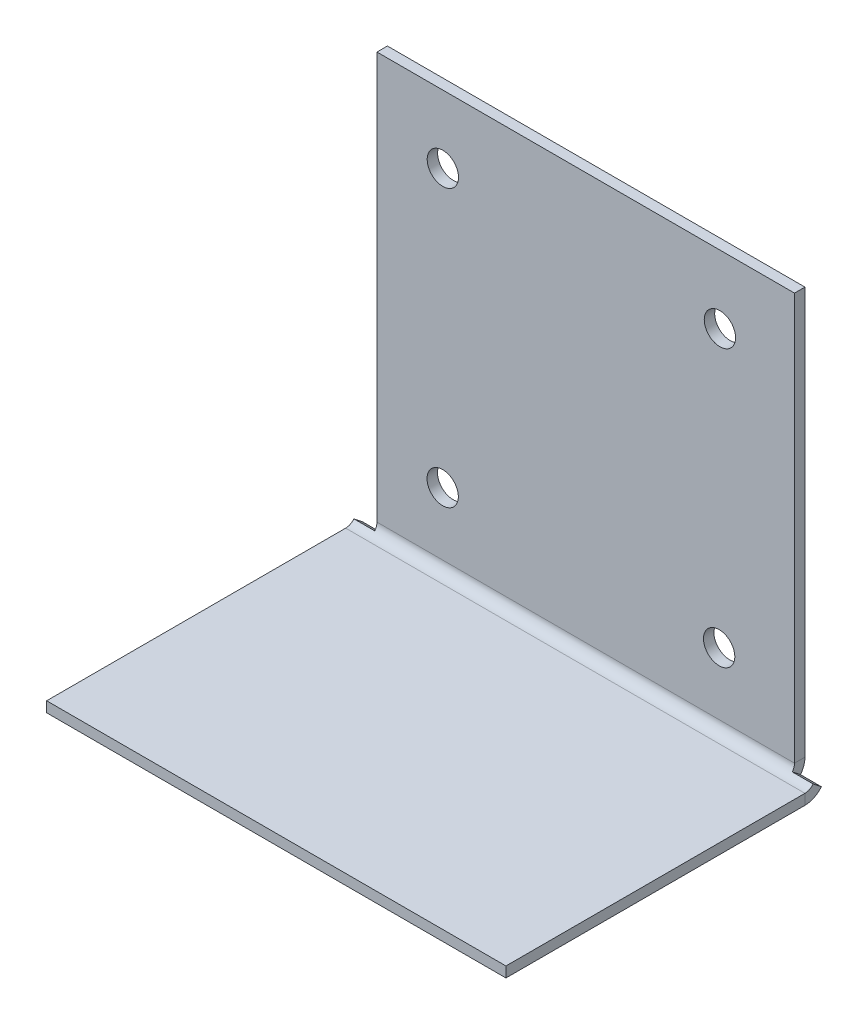
ISO-10303-21;
HEADER;
FILE_DESCRIPTION(('STEP AP214'),'2;1');
FILE_NAME('part.step','',(''),(''),'','','');
FILE_SCHEMA(('AUTOMOTIVE_DESIGN { 1 0 10303 214 1 1 1 1 }'));
ENDSEC;
DATA;
#1=APPLICATION_CONTEXT('core data for automotive mechanical design processes');
#2=APPLICATION_PROTOCOL_DEFINITION('international standard','automotive_design',2000,#1);
#3=PRODUCT_CONTEXT('',#1,'mechanical');
#4=PRODUCT('Part','Part','',(#3));
#5=PRODUCT_RELATED_PRODUCT_CATEGORY('part','',(#4));
#6=PRODUCT_DEFINITION_FORMATION('','',#4);
#7=PRODUCT_DEFINITION_CONTEXT('part definition',#1,'design');
#8=PRODUCT_DEFINITION('design','',#6,#7);
#9=PRODUCT_DEFINITION_SHAPE('','',#8);
#10=(LENGTH_UNIT() NAMED_UNIT(*) SI_UNIT(.MILLI.,.METRE.));
#11=(NAMED_UNIT(*) PLANE_ANGLE_UNIT() SI_UNIT($,.RADIAN.));
#12=(NAMED_UNIT(*) SI_UNIT($,.STERADIAN.) SOLID_ANGLE_UNIT());
#13=UNCERTAINTY_MEASURE_WITH_UNIT(LENGTH_MEASURE(1.E-05),#10,'distance_accuracy_value','');
#14=(GEOMETRIC_REPRESENTATION_CONTEXT(3) GLOBAL_UNCERTAINTY_ASSIGNED_CONTEXT((#13)) GLOBAL_UNIT_ASSIGNED_CONTEXT((#10,
#11,#12)) REPRESENTATION_CONTEXT('',''));
#15=CARTESIAN_POINT('',(0.,0.,0.));
#16=DIRECTION('',(0.,0.,1.));
#17=DIRECTION('',(1.,0.,0.));
#18=AXIS2_PLACEMENT_3D('',#15,#16,#17);
#19=CARTESIAN_POINT('',(-16.7534524957354,-16.2307969960273,1.24380550980765));
#20=DIRECTION('',(-1.,0.,0.));
#21=DIRECTION('',(0.,0.,-1.));
#22=AXIS2_PLACEMENT_3D('',#19,#20,#21);
#23=PLANE('',#22);
#24=DIRECTION('',(0.,0.,-1.));
#25=VECTOR('',#24,1.);
#26=CARTESIAN_POINT('',(-16.7534524957354,-17.2307969960274,-14.9869914862196));
#27=LINE('',#26,#25);
#28=CARTESIAN_POINT('',(-16.7534524957354,-17.2307969960272,31.2438055098077));
#29=VERTEX_POINT('',#28);
#30=CARTESIAN_POINT('',(-16.7534524957354,-17.2307969960273,2.6));
#31=VERTEX_POINT('',#30);
#32=EDGE_CURVE('E73',#29,#31,#27,.T.);
#33=ORIENTED_EDGE('',*,*,#32,.T.);
#34=DIRECTION('',(0.,1.,0.));
#35=VECTOR('',#34,1.);
#36=CARTESIAN_POINT('',(-16.7534524957354,-16.2307969960273,2.6));
#37=LINE('',#36,#35);
#38=CARTESIAN_POINT('',(-16.7534524957354,-16.2307969960273,2.6));
#39=VERTEX_POINT('',#38);
#40=EDGE_CURVE('E265',#31,#39,#37,.T.);
#41=ORIENTED_EDGE('',*,*,#40,.T.);
#42=DIRECTION('',(0.,0.,-1.));
#43=VECTOR('',#42,1.);
#44=CARTESIAN_POINT('',(-16.7534524957354,-16.2307969960273,1.24380550980765));
#45=LINE('',#44,#43);
#46=CARTESIAN_POINT('',(-16.7534524957354,-16.2307969960272,31.2438055098076));
#47=VERTEX_POINT('',#46);
#48=EDGE_CURVE('E250',#47,#39,#45,.T.);
#49=ORIENTED_EDGE('',*,*,#48,.F.);
#50=DIRECTION('',(0.,1.,0.));
#51=VECTOR('',#50,1.);
#52=CARTESIAN_POINT('',(-16.7534524957354,-16.2307969960272,31.2438055098076));
#53=LINE('',#52,#51);
#54=EDGE_CURVE('E255',#29,#47,#53,.T.);
#55=ORIENTED_EDGE('',*,*,#54,.F.);
#56=EDGE_LOOP('',(#33,#41,#49,#55));
#57=FACE_BOUND('',#56,.T.);
#58=ADVANCED_FACE('F48',(#57),#23,.F.);
#59=CARTESIAN_POINT('',(-60.7534524957354,-16.2307969960272,31.2438055098077));
#60=DIRECTION('',(1.,0.,0.));
#61=DIRECTION('',(0.,0.,1.));
#62=AXIS2_PLACEMENT_3D('',#59,#60,#61);
#63=PLANE('',#62);
#64=DIRECTION('',(0.,0.,1.));
#65=VECTOR('',#64,1.);
#66=CARTESIAN_POINT('',(-60.7534524957354,-16.2307969960272,31.2438055098077));
#67=LINE('',#66,#65);
#68=CARTESIAN_POINT('',(-60.7534524957354,-16.2307969960273,2.6));
#69=VERTEX_POINT('',#68);
#70=CARTESIAN_POINT('',(-60.7534524957354,-16.2307969960272,31.2438055098077));
#71=VERTEX_POINT('',#70);
#72=EDGE_CURVE('E52',#69,#71,#67,.T.);
#73=ORIENTED_EDGE('',*,*,#72,.F.);
#74=DIRECTION('',(0.,-1.,0.));
#75=VECTOR('',#74,1.);
#76=CARTESIAN_POINT('',(-60.7534524957354,-16.2307969960271,2.6));
#77=LINE('',#76,#75);
#78=CARTESIAN_POINT('',(-60.7534524957354,-17.2307969960273,2.6));
#79=VERTEX_POINT('',#78);
#80=EDGE_CURVE('E12',#69,#79,#77,.T.);
#81=ORIENTED_EDGE('',*,*,#80,.T.);
#82=DIRECTION('',(0.,0.,-1.));
#83=VECTOR('',#82,1.);
#84=CARTESIAN_POINT('',(-60.7534524957354,-17.2307969960274,-14.9869914862196));
#85=LINE('',#84,#83);
#86=CARTESIAN_POINT('',(-60.7534524957354,-17.2307969960272,31.2438055098077));
#87=VERTEX_POINT('',#86);
#88=EDGE_CURVE('E66',#79,#87,#85,.F.);
#89=ORIENTED_EDGE('',*,*,#88,.T.);
#90=DIRECTION('',(0.,1.,0.));
#91=VECTOR('',#90,1.);
#92=CARTESIAN_POINT('',(-60.7534524957354,-16.2307969960272,31.2438055098077));
#93=LINE('',#92,#91);
#94=EDGE_CURVE('E258',#87,#71,#93,.T.);
#95=ORIENTED_EDGE('',*,*,#94,.T.);
#96=EDGE_LOOP('',(#73,#81,#89,#95));
#97=FACE_BOUND('',#96,.T.);
#98=ADVANCED_FACE('F50',(#97),#63,.F.);
#99=CARTESIAN_POINT('',(0.,-17.2307969960274,-14.9869914862196));
#100=DIRECTION('',(0.,-1.,0.));
#101=DIRECTION('',(-1.,0.,0.));
#102=AXIS2_PLACEMENT_3D('',#99,#100,#101);
#103=PLANE('',#102);
#104=ORIENTED_EDGE('',*,*,#88,.F.);
#105=DIRECTION('',(1.,0.,0.));
#106=VECTOR('',#105,1.);
#107=CARTESIAN_POINT('',(0.,-17.2307969960273,2.6));
#108=LINE('',#107,#106);
#109=EDGE_CURVE('E58',#79,#31,#108,.T.);
#110=ORIENTED_EDGE('',*,*,#109,.T.);
#111=ORIENTED_EDGE('',*,*,#32,.F.);
#112=DIRECTION('',(-1.,0.,0.));
#113=VECTOR('',#112,1.);
#114=CARTESIAN_POINT('',(0.,-17.2307969960272,31.2438055098077));
#115=LINE('',#114,#113);
#116=EDGE_CURVE('E251',#87,#29,#115,.F.);
#117=ORIENTED_EDGE('',*,*,#116,.F.);
#118=EDGE_LOOP('',(#104,#110,#111,#117));
#119=FACE_BOUND('',#118,.T.);
#120=ADVANCED_FACE('F342',(#119),#103,.T.);
#121=CARTESIAN_POINT('',(-16.7534524957354,-16.2307969960272,31.2438055098076));
#122=DIRECTION('',(0.,0.,-1.));
#123=DIRECTION('',(1.,0.,0.));
#124=AXIS2_PLACEMENT_3D('',#121,#122,#123);
#125=PLANE('',#124);
#126=ORIENTED_EDGE('',*,*,#94,.F.);
#127=ORIENTED_EDGE('',*,*,#116,.T.);
#128=ORIENTED_EDGE('',*,*,#54,.T.);
#129=DIRECTION('',(1.,0.,0.));
#130=VECTOR('',#129,1.);
#131=CARTESIAN_POINT('',(-16.7534524957354,-16.2307969960272,31.2438055098076));
#132=LINE('',#131,#130);
#133=EDGE_CURVE('E246',#71,#47,#132,.T.);
#134=ORIENTED_EDGE('',*,*,#133,.F.);
#135=EDGE_LOOP('',(#126,#127,#128,#134));
#136=FACE_BOUND('',#135,.T.);
#137=ADVANCED_FACE('F347',(#136),#125,.F.);
#138=CARTESIAN_POINT('',(0.,-16.2307969960274,-14.9869914862196));
#139=DIRECTION('',(0.,-1.,0.));
#140=DIRECTION('',(-1.,0.,0.));
#141=AXIS2_PLACEMENT_3D('',#138,#139,#140);
#142=PLANE('',#141);
#143=DIRECTION('',(1.,0.,0.));
#144=VECTOR('',#143,1.);
#145=CARTESIAN_POINT('',(0.,-16.2307969960273,2.6));
#146=LINE('',#145,#144);
#147=EDGE_CURVE('E262',#69,#39,#146,.T.);
#148=ORIENTED_EDGE('',*,*,#147,.F.);
#149=ORIENTED_EDGE('',*,*,#72,.T.);
#150=ORIENTED_EDGE('',*,*,#133,.T.);
#151=ORIENTED_EDGE('',*,*,#48,.T.);
#152=EDGE_LOOP('',(#148,#149,#150,#151));
#153=FACE_BOUND('',#152,.T.);
#154=ADVANCED_FACE('F277',(#153),#142,.F.);
#155=CARTESIAN_POINT('',(-58.7534524957354,23.7692030039727,1.6));
#156=DIRECTION('',(0.,-1.,0.));
#157=DIRECTION('',(-1.,0.,0.));
#158=AXIS2_PLACEMENT_3D('',#155,#156,#157);
#159=PLANE('',#158);
#160=DIRECTION('',(0.,0.,1.));
#161=VECTOR('',#160,1.);
#162=CARTESIAN_POINT('',(-18.7534524957354,23.7692030039727,1.6));
#163=LINE('',#162,#161);
#164=CARTESIAN_POINT('',(-18.7534524957354,23.7692030039727,0.6));
#165=VERTEX_POINT('',#164);
#166=CARTESIAN_POINT('',(-18.7534524957354,23.7692030039727,1.6));
#167=VERTEX_POINT('',#166);
#168=EDGE_CURVE('E207',#165,#167,#163,.T.);
#169=ORIENTED_EDGE('',*,*,#168,.F.);
#170=DIRECTION('',(-1.,0.,0.));
#171=VECTOR('',#170,1.);
#172=CARTESIAN_POINT('',(0.,23.7692030039727,0.6));
#173=LINE('',#172,#171);
#174=CARTESIAN_POINT('',(-58.7534524957354,23.7692030039727,0.6));
#175=VERTEX_POINT('',#174);
#176=EDGE_CURVE('E231',#165,#175,#173,.T.);
#177=ORIENTED_EDGE('',*,*,#176,.T.);
#178=DIRECTION('',(0.,0.,1.));
#179=VECTOR('',#178,1.);
#180=CARTESIAN_POINT('',(-58.7534524957354,23.7692030039727,1.6));
#181=LINE('',#180,#179);
#182=CARTESIAN_POINT('',(-58.7534524957354,23.7692030039727,1.6));
#183=VERTEX_POINT('',#182);
#184=EDGE_CURVE('E228',#175,#183,#181,.T.);
#185=ORIENTED_EDGE('',*,*,#184,.T.);
#186=DIRECTION('',(-1.,0.,0.));
#187=VECTOR('',#186,1.);
#188=CARTESIAN_POINT('',(-58.7534524957354,23.7692030039727,1.6));
#189=LINE('',#188,#187);
#190=EDGE_CURVE('E214',#167,#183,#189,.T.);
#191=ORIENTED_EDGE('',*,*,#190,.F.);
#192=EDGE_LOOP('',(#169,#177,#185,#191));
#193=FACE_BOUND('',#192,.T.);
#194=ADVANCED_FACE('F321',(#193),#159,.F.);
#195=CARTESIAN_POINT('',(0.,0.,1.6));
#196=DIRECTION('',(0.,0.,-1.));
#197=DIRECTION('',(-1.,0.,0.));
#198=AXIS2_PLACEMENT_3D('',#195,#196,#197);
#199=PLANE('',#198);
#200=CARTESIAN_POINT('',(-25.9011337532143,17.2438518574703,1.6));
#201=DIRECTION('',(0.,0.,-1.));
#202=DIRECTION('',(-1.,0.,0.));
#203=AXIS2_PLACEMENT_3D('',#200,#201,#202);
#204=CIRCLE('',#203,1.49999999999999);
#205=CARTESIAN_POINT('',(-27.4011337532142,17.2438518574703,1.6));
#206=VERTEX_POINT('',#205);
#207=EDGE_CURVE('E396',#206,#206,#204,.T.);
#208=ORIENTED_EDGE('',*,*,#207,.T.);
#209=EDGE_LOOP('',(#208));
#210=FACE_BOUND('',#209,.T.);
#211=CARTESIAN_POINT('',(-52.4431202385651,17.2739049417213,1.6));
#212=DIRECTION('',(0.,0.,-1.));
#213=DIRECTION('',(-1.,0.,0.));
#214=AXIS2_PLACEMENT_3D('',#211,#212,#213);
#215=CIRCLE('',#214,1.49999999999999);
#216=CARTESIAN_POINT('',(-53.9431202385651,17.2739049417213,1.6));
#217=VERTEX_POINT('',#216);
#218=EDGE_CURVE('E390',#217,#217,#215,.T.);
#219=ORIENTED_EDGE('',*,*,#218,.T.);
#220=EDGE_LOOP('',(#219));
#221=FACE_BOUND('',#220,.T.);
#222=CARTESIAN_POINT('',(-25.9729526557759,-9.25790340729611,1.6));
#223=DIRECTION('',(0.,0.,-1.));
#224=DIRECTION('',(-1.,0.,0.));
#225=AXIS2_PLACEMENT_3D('',#222,#223,#224);
#226=CIRCLE('',#225,1.49999999999999);
#227=CARTESIAN_POINT('',(-27.4729526557758,-9.25790340729611,1.6));
#228=VERTEX_POINT('',#227);
#229=EDGE_CURVE('E380',#228,#228,#226,.T.);
#230=ORIENTED_EDGE('',*,*,#229,.T.);
#231=EDGE_LOOP('',(#230));
#232=FACE_BOUND('',#231,.T.);
#233=CARTESIAN_POINT('',(-52.4574838355913,-9.22245051781557,1.6));
#234=DIRECTION('',(0.,0.,-1.));
#235=DIRECTION('',(-1.,0.,0.));
#236=AXIS2_PLACEMENT_3D('',#233,#234,#235);
#237=CIRCLE('',#236,1.49999999999999);
#238=CARTESIAN_POINT('',(-53.9574838355913,-9.22245051781557,1.6));
#239=VERTEX_POINT('',#238);
#240=EDGE_CURVE('E197',#239,#239,#237,.T.);
#241=ORIENTED_EDGE('',*,*,#240,.T.);
#242=EDGE_LOOP('',(#241));
#243=FACE_BOUND('',#242,.T.);
#244=DIRECTION('',(0.,-1.,0.));
#245=VECTOR('',#244,1.);
#246=CARTESIAN_POINT('',(-58.7534524957354,-16.2307969960273,1.6));
#247=LINE('',#246,#245);
#248=CARTESIAN_POINT('',(-58.7534524957354,-15.2307969960273,1.6));
#249=VERTEX_POINT('',#248);
#250=EDGE_CURVE('E225',#183,#249,#247,.T.);
#251=ORIENTED_EDGE('',*,*,#250,.T.);
#252=DIRECTION('',(1.,0.,0.));
#253=VECTOR('',#252,1.);
#254=CARTESIAN_POINT('',(0.,-15.2307969960273,1.6));
#255=LINE('',#254,#253);
#256=CARTESIAN_POINT('',(-18.7534524957354,-15.2307969960273,1.6));
#257=VERTEX_POINT('',#256);
#258=EDGE_CURVE('E221',#249,#257,#255,.T.);
#259=ORIENTED_EDGE('',*,*,#258,.T.);
#260=DIRECTION('',(0.,1.,0.));
#261=VECTOR('',#260,1.);
#262=CARTESIAN_POINT('',(-18.7534524957354,23.7692030039727,1.6));
#263=LINE('',#262,#261);
#264=EDGE_CURVE('E218',#257,#167,#263,.T.);
#265=ORIENTED_EDGE('',*,*,#264,.T.);
#266=ORIENTED_EDGE('',*,*,#190,.T.);
#267=EDGE_LOOP('',(#251,#259,#265,#266));
#268=FACE_BOUND('',#267,.T.);
#269=ADVANCED_FACE('F323',(#210,#221,#232,#243,#268),#199,.F.);
#270=CARTESIAN_POINT('',(-18.7534524957354,23.7692030039727,1.6));
#271=DIRECTION('',(-1.,0.,0.));
#272=DIRECTION('',(0.,1.,0.));
#273=AXIS2_PLACEMENT_3D('',#270,#271,#272);
#274=PLANE('',#273);
#275=DIRECTION('',(0.,0.,1.));
#276=VECTOR('',#275,1.);
#277=CARTESIAN_POINT('',(-18.7534524957354,-15.2307969960273,1.59999999999973));
#278=LINE('',#277,#276);
#279=CARTESIAN_POINT('',(-18.7534524957354,-15.2307969960273,0.6));
#280=VERTEX_POINT('',#279);
#281=EDGE_CURVE('E235',#280,#257,#278,.T.);
#282=ORIENTED_EDGE('',*,*,#281,.F.);
#283=DIRECTION('',(0.,1.,0.));
#284=VECTOR('',#283,1.);
#285=CARTESIAN_POINT('',(-18.7534524957354,0.,0.6));
#286=LINE('',#285,#284);
#287=EDGE_CURVE('E211',#280,#165,#286,.T.);
#288=ORIENTED_EDGE('',*,*,#287,.T.);
#289=ORIENTED_EDGE('',*,*,#168,.T.);
#290=ORIENTED_EDGE('',*,*,#264,.F.);
#291=EDGE_LOOP('',(#282,#288,#289,#290));
#292=FACE_BOUND('',#291,.T.);
#293=ADVANCED_FACE('F302',(#292),#274,.F.);
#294=CARTESIAN_POINT('',(0.,0.,0.6));
#295=DIRECTION('',(0.,0.,-1.));
#296=DIRECTION('',(-1.,0.,0.));
#297=AXIS2_PLACEMENT_3D('',#294,#295,#296);
#298=PLANE('',#297);
#299=CARTESIAN_POINT('',(-25.9011337532143,17.2438518574703,0.599999999999998));
#300=DIRECTION('',(0.,0.,-1.));
#301=DIRECTION('',(-1.,0.,0.));
#302=AXIS2_PLACEMENT_3D('',#299,#300,#301);
#303=CIRCLE('',#302,1.49999999999999);
#304=CARTESIAN_POINT('',(-27.4011337532142,17.2438518574703,0.599999999999998));
#305=VERTEX_POINT('',#304);
#306=EDGE_CURVE('E366',#305,#305,#303,.T.);
#307=ORIENTED_EDGE('',*,*,#306,.F.);
#308=EDGE_LOOP('',(#307));
#309=FACE_BOUND('',#308,.T.);
#310=CARTESIAN_POINT('',(-52.4431202385651,17.2739049417213,0.599999999999998));
#311=DIRECTION('',(0.,0.,-1.));
#312=DIRECTION('',(-1.,0.,0.));
#313=AXIS2_PLACEMENT_3D('',#310,#311,#312);
#314=CIRCLE('',#313,1.49999999999999);
#315=CARTESIAN_POINT('',(-53.9431202385651,17.2739049417213,0.599999999999998));
#316=VERTEX_POINT('',#315);
#317=EDGE_CURVE('E370',#316,#316,#314,.T.);
#318=ORIENTED_EDGE('',*,*,#317,.F.);
#319=EDGE_LOOP('',(#318));
#320=FACE_BOUND('',#319,.T.);
#321=CARTESIAN_POINT('',(-25.9729526557759,-9.25790340729611,0.599999999999998));
#322=DIRECTION('',(0.,0.,-1.));
#323=DIRECTION('',(-1.,0.,0.));
#324=AXIS2_PLACEMENT_3D('',#321,#322,#323);
#325=CIRCLE('',#324,1.49999999999999);
#326=CARTESIAN_POINT('',(-27.4729526557758,-9.25790340729611,0.599999999999998));
#327=VERTEX_POINT('',#326);
#328=EDGE_CURVE('E374',#327,#327,#325,.T.);
#329=ORIENTED_EDGE('',*,*,#328,.F.);
#330=EDGE_LOOP('',(#329));
#331=FACE_BOUND('',#330,.T.);
#332=CARTESIAN_POINT('',(-52.4574838355913,-9.22245051781557,0.599999999999998));
#333=DIRECTION('',(0.,0.,-1.));
#334=DIRECTION('',(-1.,0.,0.));
#335=AXIS2_PLACEMENT_3D('',#332,#333,#334);
#336=CIRCLE('',#335,1.49999999999999);
#337=CARTESIAN_POINT('',(-53.9574838355913,-9.22245051781557,0.599999999999998));
#338=VERTEX_POINT('',#337);
#339=EDGE_CURVE('E377',#338,#338,#336,.T.);
#340=ORIENTED_EDGE('',*,*,#339,.F.);
#341=EDGE_LOOP('',(#340));
#342=FACE_BOUND('',#341,.T.);
#343=DIRECTION('',(1.,0.,0.));
#344=VECTOR('',#343,1.);
#345=CARTESIAN_POINT('',(0.,-15.2307969960273,0.6));
#346=LINE('',#345,#344);
#347=CARTESIAN_POINT('',(-58.7534524957354,-15.2307969960273,0.6));
#348=VERTEX_POINT('',#347);
#349=EDGE_CURVE('E239',#348,#280,#346,.T.);
#350=ORIENTED_EDGE('',*,*,#349,.F.);
#351=DIRECTION('',(0.,1.,0.));
#352=VECTOR('',#351,1.);
#353=CARTESIAN_POINT('',(-58.7534524957354,0.,0.6));
#354=LINE('',#353,#352);
#355=EDGE_CURVE('E204',#175,#348,#354,.F.);
#356=ORIENTED_EDGE('',*,*,#355,.F.);
#357=ORIENTED_EDGE('',*,*,#176,.F.);
#358=ORIENTED_EDGE('',*,*,#287,.F.);
#359=EDGE_LOOP('',(#350,#356,#357,#358));
#360=FACE_BOUND('',#359,.T.);
#361=ADVANCED_FACE('F311',(#309,#320,#331,#342,#360),#298,.T.);
#362=CARTESIAN_POINT('',(-58.7534524957354,-16.2307969960273,1.6));
#363=DIRECTION('',(1.,0.,0.));
#364=DIRECTION('',(0.,-1.,0.));
#365=AXIS2_PLACEMENT_3D('',#362,#363,#364);
#366=PLANE('',#365);
#367=DIRECTION('',(0.,0.,-1.));
#368=VECTOR('',#367,1.);
#369=CARTESIAN_POINT('',(-58.7534524957354,-15.2307969960273,1.60000000000001));
#370=LINE('',#369,#368);
#371=EDGE_CURVE('E150',#249,#348,#370,.T.);
#372=ORIENTED_EDGE('',*,*,#371,.F.);
#373=ORIENTED_EDGE('',*,*,#250,.F.);
#374=ORIENTED_EDGE('',*,*,#184,.F.);
#375=ORIENTED_EDGE('',*,*,#355,.T.);
#376=EDGE_LOOP('',(#372,#373,#374,#375));
#377=FACE_BOUND('',#376,.T.);
#378=ADVANCED_FACE('F318',(#377),#366,.F.);
#379=CARTESIAN_POINT('',(-60.7534524957354,-15.2307969960273,2.6));
#380=DIRECTION('',(1.,0.,0.));
#381=DIRECTION('',(0.,0.,-1.));
#382=AXIS2_PLACEMENT_3D('',#379,#380,#381);
#383=PLANE('',#382);
#384=DIRECTION('',(0.,0.618369803069735,0.78588726077695));
#385=VECTOR('',#384,1.);
#386=CARTESIAN_POINT('',(-60.7534524957354,-15.849166799097,1.81411273922305));
#387=LINE('',#386,#385);
#388=CARTESIAN_POINT('',(-60.7534524957354,-16.4675366021668,1.0282254784461));
#389=VERTEX_POINT('',#388);
#390=CARTESIAN_POINT('',(-60.7534524957354,-15.849166799097,1.81411273922305));
#391=VERTEX_POINT('',#390);
#392=EDGE_CURVE('E139',#389,#391,#387,.T.);
#393=ORIENTED_EDGE('',*,*,#392,.F.);
#394=CARTESIAN_POINT('',(-60.7534524957354,-15.2307969960273,2.6));
#395=DIRECTION('',(1.,0.,0.));
#396=DIRECTION('',(0.,0.,-1.));
#397=AXIS2_PLACEMENT_3D('',#394,#395,#396);
#398=CIRCLE('',#397,2.);
#399=EDGE_CURVE('E194',#389,#79,#398,.F.);
#400=ORIENTED_EDGE('',*,*,#399,.T.);
#401=ORIENTED_EDGE('',*,*,#80,.F.);
#402=CARTESIAN_POINT('',(-60.7534524957354,-15.2307969960273,2.6));
#403=DIRECTION('',(-1.,0.,0.));
#404=DIRECTION('',(0.,0.,1.));
#405=AXIS2_PLACEMENT_3D('',#402,#403,#404);
#406=CIRCLE('',#405,0.999999999999997);
#407=EDGE_CURVE('E155',#391,#69,#406,.T.);
#408=ORIENTED_EDGE('',*,*,#407,.F.);
#409=EDGE_LOOP('',(#393,#400,#401,#408));
#410=FACE_BOUND('',#409,.T.);
#411=ADVANCED_FACE('F156',(#410),#383,.F.);
#412=CARTESIAN_POINT('',(-16.7534524957354,-15.2307969960273,2.6));
#413=DIRECTION('',(-1.,0.,0.));
#414=DIRECTION('',(0.,0.,1.));
#415=AXIS2_PLACEMENT_3D('',#412,#413,#414);
#416=PLANE('',#415);
#417=ORIENTED_EDGE('',*,*,#40,.F.);
#418=CARTESIAN_POINT('',(-16.7534524957354,-15.2307969960273,2.6));
#419=DIRECTION('',(1.,0.,0.));
#420=DIRECTION('',(0.,0.,-1.));
#421=AXIS2_PLACEMENT_3D('',#418,#419,#420);
#422=CIRCLE('',#421,2.);
#423=CARTESIAN_POINT('',(-16.7534524957354,-16.4675366021668,1.0282254784461));
#424=VERTEX_POINT('',#423);
#425=EDGE_CURVE('E190',#31,#424,#422,.T.);
#426=ORIENTED_EDGE('',*,*,#425,.T.);
#427=DIRECTION('',(0.,0.618369803069735,0.785887260776949));
#428=VECTOR('',#427,1.);
#429=CARTESIAN_POINT('',(-16.7534524957354,-15.849166799097,1.81411273922305));
#430=LINE('',#429,#428);
#431=CARTESIAN_POINT('',(-16.7534524957354,-15.849166799097,1.81411273922305));
#432=VERTEX_POINT('',#431);
#433=EDGE_CURVE('E151',#424,#432,#430,.T.);
#434=ORIENTED_EDGE('',*,*,#433,.T.);
#435=CARTESIAN_POINT('',(-16.7534524957354,-15.2307969960273,2.6));
#436=DIRECTION('',(1.,0.,0.));
#437=DIRECTION('',(0.,0.,-1.));
#438=AXIS2_PLACEMENT_3D('',#435,#436,#437);
#439=CIRCLE('',#438,0.999999999999997);
#440=EDGE_CURVE('E160',#39,#432,#439,.T.);
#441=ORIENTED_EDGE('',*,*,#440,.F.);
#442=EDGE_LOOP('',(#417,#426,#434,#441));
#443=FACE_BOUND('',#442,.T.);
#444=ADVANCED_FACE('F286',(#443),#416,.F.);
#445=CARTESIAN_POINT('',(-17.7534524957354,-15.849166799097,1.81411273922305));
#446=DIRECTION('',(0.,-0.785887260776949,0.618369803069735));
#447=DIRECTION('',(-1.,0.,0.));
#448=AXIS2_PLACEMENT_3D('',#445,#446,#447);
#449=PLANE('',#448);
#450=ORIENTED_EDGE('',*,*,#433,.F.);
#451=DIRECTION('',(1.,0.,0.));
#452=VECTOR('',#451,1.);
#453=CARTESIAN_POINT('',(-82.8278402110016,-16.4675366021668,1.0282254784461));
#454=LINE('',#453,#452);
#455=CARTESIAN_POINT('',(-18.7534524957354,-16.4675366021668,1.0282254784461));
#456=VERTEX_POINT('',#455);
#457=EDGE_CURVE('E186',#424,#456,#454,.F.);
#458=ORIENTED_EDGE('',*,*,#457,.T.);
#459=DIRECTION('',(0.,0.618369803069735,0.785887260776949));
#460=VECTOR('',#459,1.);
#461=CARTESIAN_POINT('',(-18.7534524957354,-15.849166799097,1.81411273922305));
#462=LINE('',#461,#460);
#463=CARTESIAN_POINT('',(-18.7534524957354,-15.849166799097,1.81411273922305));
#464=VERTEX_POINT('',#463);
#465=EDGE_CURVE('E172',#456,#464,#462,.T.);
#466=ORIENTED_EDGE('',*,*,#465,.T.);
#467=DIRECTION('',(-1.,0.,0.));
#468=VECTOR('',#467,1.);
#469=CARTESIAN_POINT('',(-16.7534524957354,-15.849166799097,1.81411273922305));
#470=LINE('',#469,#468);
#471=EDGE_CURVE('E289',#432,#464,#470,.T.);
#472=ORIENTED_EDGE('',*,*,#471,.F.);
#473=EDGE_LOOP('',(#450,#458,#466,#472));
#474=FACE_BOUND('',#473,.T.);
#475=ADVANCED_FACE('F427',(#474),#449,.F.);
#476=CARTESIAN_POINT('',(-18.7534524957354,-15.2307969960273,2.6));
#477=DIRECTION('',(-1.,0.,0.));
#478=DIRECTION('',(0.,0.,1.));
#479=AXIS2_PLACEMENT_3D('',#476,#477,#478);
#480=PLANE('',#479);
#481=ORIENTED_EDGE('',*,*,#465,.F.);
#482=CARTESIAN_POINT('',(-18.7534524957354,-15.2307969960273,2.6));
#483=DIRECTION('',(1.,0.,0.));
#484=DIRECTION('',(0.,0.,-1.));
#485=AXIS2_PLACEMENT_3D('',#482,#483,#484);
#486=CIRCLE('',#485,2.);
#487=EDGE_CURVE('E182',#456,#280,#486,.T.);
#488=ORIENTED_EDGE('',*,*,#487,.T.);
#489=ORIENTED_EDGE('',*,*,#281,.T.);
#490=CARTESIAN_POINT('',(-18.7534524957354,-15.2307969960273,2.6));
#491=DIRECTION('',(1.,0.,0.));
#492=DIRECTION('',(0.,0.,-1.));
#493=AXIS2_PLACEMENT_3D('',#490,#491,#492);
#494=CIRCLE('',#493,0.999999999999997);
#495=EDGE_CURVE('E174',#464,#257,#494,.T.);
#496=ORIENTED_EDGE('',*,*,#495,.F.);
#497=EDGE_LOOP('',(#481,#488,#489,#496));
#498=FACE_BOUND('',#497,.T.);
#499=ADVANCED_FACE('F298',(#498),#480,.F.);
#500=CARTESIAN_POINT('',(-58.7534524957354,-15.2307969960273,2.6));
#501=DIRECTION('',(1.,0.,0.));
#502=DIRECTION('',(0.,0.,-1.));
#503=AXIS2_PLACEMENT_3D('',#500,#501,#502);
#504=PLANE('',#503);
#505=ORIENTED_EDGE('',*,*,#371,.T.);
#506=CARTESIAN_POINT('',(-58.7534524957354,-15.2307969960273,2.6));
#507=DIRECTION('',(1.,0.,0.));
#508=DIRECTION('',(0.,0.,-1.));
#509=AXIS2_PLACEMENT_3D('',#506,#507,#508);
#510=CIRCLE('',#509,2.);
#511=CARTESIAN_POINT('',(-58.7534524957354,-16.4675366021668,1.0282254784461));
#512=VERTEX_POINT('',#511);
#513=EDGE_CURVE('E178',#348,#512,#510,.F.);
#514=ORIENTED_EDGE('',*,*,#513,.T.);
#515=DIRECTION('',(0.,0.618369803069735,0.78588726077695));
#516=VECTOR('',#515,1.);
#517=CARTESIAN_POINT('',(-58.7534524957354,-15.849166799097,1.81411273922305));
#518=LINE('',#517,#516);
#519=CARTESIAN_POINT('',(-58.7534524957354,-15.849166799097,1.81411273922305));
#520=VERTEX_POINT('',#519);
#521=EDGE_CURVE('E168',#512,#520,#518,.T.);
#522=ORIENTED_EDGE('',*,*,#521,.T.);
#523=CARTESIAN_POINT('',(-58.7534524957354,-15.2307969960273,2.6));
#524=DIRECTION('',(-1.,0.,0.));
#525=DIRECTION('',(0.,0.,1.));
#526=AXIS2_PLACEMENT_3D('',#523,#524,#525);
#527=CIRCLE('',#526,0.999999999999997);
#528=EDGE_CURVE('E166',#249,#520,#527,.T.);
#529=ORIENTED_EDGE('',*,*,#528,.F.);
#530=EDGE_LOOP('',(#505,#514,#522,#529));
#531=FACE_BOUND('',#530,.T.);
#532=ADVANCED_FACE('F315',(#531),#504,.F.);
#533=CARTESIAN_POINT('',(-59.7534524957354,-15.849166799097,1.81411273922305));
#534=DIRECTION('',(0.,-0.785887260776949,0.618369803069735));
#535=DIRECTION('',(-1.,0.,0.));
#536=AXIS2_PLACEMENT_3D('',#533,#534,#535);
#537=PLANE('',#536);
#538=DIRECTION('',(1.,0.,0.));
#539=VECTOR('',#538,1.);
#540=CARTESIAN_POINT('',(-82.8278402110016,-16.4675366021668,1.0282254784461));
#541=LINE('',#540,#539);
#542=EDGE_CURVE('E145',#512,#389,#541,.F.);
#543=ORIENTED_EDGE('',*,*,#542,.T.);
#544=ORIENTED_EDGE('',*,*,#392,.T.);
#545=DIRECTION('',(-1.,0.,0.));
#546=VECTOR('',#545,1.);
#547=CARTESIAN_POINT('',(-58.7534524957354,-15.849166799097,1.81411273922305));
#548=LINE('',#547,#546);
#549=EDGE_CURVE('E143',#520,#391,#548,.T.);
#550=ORIENTED_EDGE('',*,*,#549,.F.);
#551=ORIENTED_EDGE('',*,*,#521,.F.);
#552=EDGE_LOOP('',(#543,#544,#550,#551));
#553=FACE_BOUND('',#552,.T.);
#554=ADVANCED_FACE('F141',(#553),#537,.F.);
#555=CARTESIAN_POINT('',(-82.8278402110016,-15.2307969960273,2.6));
#556=DIRECTION('',(1.,0.,0.));
#557=DIRECTION('',(0.,0.,-1.));
#558=AXIS2_PLACEMENT_3D('',#555,#556,#557);
#559=CYLINDRICAL_SURFACE('',#558,0.999999999999997);
#560=ORIENTED_EDGE('',*,*,#528,.T.);
#561=ORIENTED_EDGE('',*,*,#549,.T.);
#562=ORIENTED_EDGE('',*,*,#407,.T.);
#563=ORIENTED_EDGE('',*,*,#147,.T.);
#564=ORIENTED_EDGE('',*,*,#440,.T.);
#565=ORIENTED_EDGE('',*,*,#471,.T.);
#566=ORIENTED_EDGE('',*,*,#495,.T.);
#567=ORIENTED_EDGE('',*,*,#258,.F.);
#568=EDGE_LOOP('',(#560,#561,#562,#563,#564,#565,#566,#567));
#569=FACE_BOUND('',#568,.T.);
#570=ADVANCED_FACE('F163',(#569),#559,.F.);
#571=CARTESIAN_POINT('',(-82.8278402110016,-15.2307969960273,2.6));
#572=DIRECTION('',(1.,0.,0.));
#573=DIRECTION('',(0.,0.,-1.));
#574=AXIS2_PLACEMENT_3D('',#571,#572,#573);
#575=CYLINDRICAL_SURFACE('',#574,2.);
#576=ORIENTED_EDGE('',*,*,#513,.F.);
#577=ORIENTED_EDGE('',*,*,#349,.T.);
#578=ORIENTED_EDGE('',*,*,#487,.F.);
#579=ORIENTED_EDGE('',*,*,#457,.F.);
#580=ORIENTED_EDGE('',*,*,#425,.F.);
#581=ORIENTED_EDGE('',*,*,#109,.F.);
#582=ORIENTED_EDGE('',*,*,#399,.F.);
#583=ORIENTED_EDGE('',*,*,#542,.F.);
#584=EDGE_LOOP('',(#576,#577,#578,#579,#580,#581,#582,#583));
#585=FACE_BOUND('',#584,.T.);
#586=ADVANCED_FACE('F307',(#585),#575,.T.);
#587=CARTESIAN_POINT('',(-52.4574838355913,-9.22245051781557,0.6));
#588=DIRECTION('',(0.,0.,-1.));
#589=DIRECTION('',(-1.,0.,0.));
#590=AXIS2_PLACEMENT_3D('',#587,#588,#589);
#591=CYLINDRICAL_SURFACE('',#590,1.49999999999999);
#592=ORIENTED_EDGE('',*,*,#339,.T.);
#593=EDGE_LOOP('',(#592));
#594=FACE_BOUND('',#593,.T.);
#595=ORIENTED_EDGE('',*,*,#240,.F.);
#596=EDGE_LOOP('',(#595));
#597=FACE_BOUND('',#596,.T.);
#598=ADVANCED_FACE('F415',(#594,#597),#591,.F.);
#599=CARTESIAN_POINT('',(-25.9729526557759,-9.25790340729611,0.6));
#600=DIRECTION('',(0.,0.,-1.));
#601=DIRECTION('',(-1.,0.,0.));
#602=AXIS2_PLACEMENT_3D('',#599,#600,#601);
#603=CYLINDRICAL_SURFACE('',#602,1.49999999999999);
#604=ORIENTED_EDGE('',*,*,#328,.T.);
#605=EDGE_LOOP('',(#604));
#606=FACE_BOUND('',#605,.T.);
#607=ORIENTED_EDGE('',*,*,#229,.F.);
#608=EDGE_LOOP('',(#607));
#609=FACE_BOUND('',#608,.T.);
#610=ADVANCED_FACE('F409',(#606,#609),#603,.F.);
#611=CARTESIAN_POINT('',(-52.4431202385651,17.2739049417213,0.6));
#612=DIRECTION('',(0.,0.,-1.));
#613=DIRECTION('',(-1.,0.,0.));
#614=AXIS2_PLACEMENT_3D('',#611,#612,#613);
#615=CYLINDRICAL_SURFACE('',#614,1.49999999999999);
#616=ORIENTED_EDGE('',*,*,#317,.T.);
#617=EDGE_LOOP('',(#616));
#618=FACE_BOUND('',#617,.T.);
#619=ORIENTED_EDGE('',*,*,#218,.F.);
#620=EDGE_LOOP('',(#619));
#621=FACE_BOUND('',#620,.T.);
#622=ADVANCED_FACE('F404',(#618,#621),#615,.F.);
#623=CARTESIAN_POINT('',(-25.9011337532143,17.2438518574703,0.6));
#624=DIRECTION('',(0.,0.,-1.));
#625=DIRECTION('',(-1.,0.,0.));
#626=AXIS2_PLACEMENT_3D('',#623,#624,#625);
#627=CYLINDRICAL_SURFACE('',#626,1.49999999999999);
#628=ORIENTED_EDGE('',*,*,#306,.T.);
#629=EDGE_LOOP('',(#628));
#630=FACE_BOUND('',#629,.T.);
#631=ORIENTED_EDGE('',*,*,#207,.F.);
#632=EDGE_LOOP('',(#631));
#633=FACE_BOUND('',#632,.T.);
#634=ADVANCED_FACE('F401',(#630,#633),#627,.F.);
#635=CLOSED_SHELL('',(#58,#98,#120,#137,#154,#194,#269,#293,#361,#378,#411,#444,#475,#499,#532,
#554,#570,#586,#598,#610,#622,#634));
#636=MANIFOLD_SOLID_BREP('B2',#635);
#637=ADVANCED_BREP_SHAPE_REPRESENTATION('',(#18,#636),#14);
#638=SHAPE_DEFINITION_REPRESENTATION(#9,#637);
ENDSEC;
END-ISO-10303-21;
